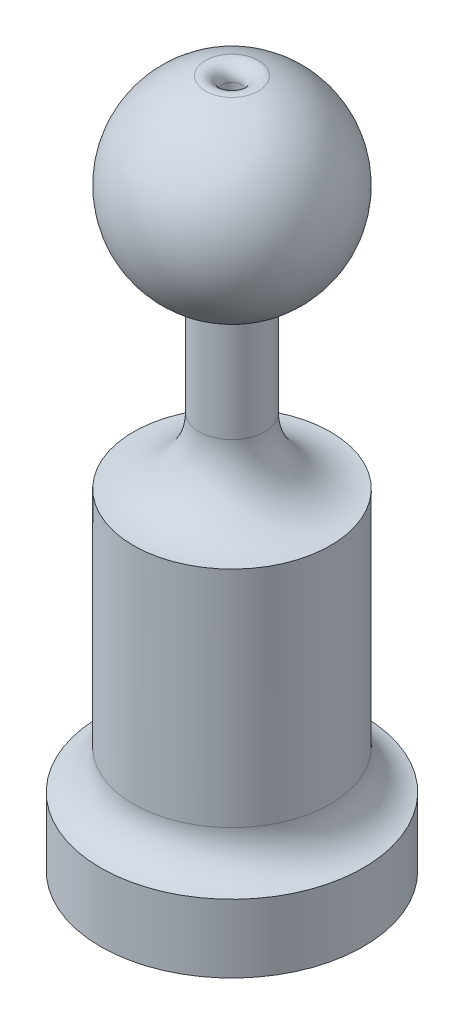
ISO-10303-21;
HEADER;
FILE_DESCRIPTION(('STEP AP214'),'2;1');
FILE_NAME('part.step','',(''),(''),'','','');
FILE_SCHEMA(('AUTOMOTIVE_DESIGN { 1 0 10303 214 1 1 1 1 }'));
ENDSEC;
DATA;
#1=APPLICATION_CONTEXT('core data for automotive mechanical design processes');
#2=APPLICATION_PROTOCOL_DEFINITION('international standard','automotive_design',2000,#1);
#3=PRODUCT_CONTEXT('',#1,'mechanical');
#4=PRODUCT('Part','Part','',(#3));
#5=PRODUCT_RELATED_PRODUCT_CATEGORY('part','',(#4));
#6=PRODUCT_DEFINITION_FORMATION('','',#4);
#7=PRODUCT_DEFINITION_CONTEXT('part definition',#1,'design');
#8=PRODUCT_DEFINITION('design','',#6,#7);
#9=PRODUCT_DEFINITION_SHAPE('','',#8);
#10=(LENGTH_UNIT() NAMED_UNIT(*) SI_UNIT(.MILLI.,.METRE.));
#11=(NAMED_UNIT(*) PLANE_ANGLE_UNIT() SI_UNIT($,.RADIAN.));
#12=(NAMED_UNIT(*) SI_UNIT($,.STERADIAN.) SOLID_ANGLE_UNIT());
#13=UNCERTAINTY_MEASURE_WITH_UNIT(LENGTH_MEASURE(1.E-05),#10,'distance_accuracy_value','');
#14=(GEOMETRIC_REPRESENTATION_CONTEXT(3) GLOBAL_UNCERTAINTY_ASSIGNED_CONTEXT((#13)) GLOBAL_UNIT_ASSIGNED_CONTEXT((#10,
#11,#12)) REPRESENTATION_CONTEXT('',''));
#15=CARTESIAN_POINT('',(0.,0.,0.));
#16=DIRECTION('',(0.,0.,1.));
#17=DIRECTION('',(1.,0.,0.));
#18=AXIS2_PLACEMENT_3D('',#15,#16,#17);
#19=CARTESIAN_POINT('',(-14.2773261963955,47.3146820377483,0.));
#20=DIRECTION('',(0.,-1.,0.));
#21=DIRECTION('',(0.,0.,-1.));
#22=AXIS2_PLACEMENT_3D('',#19,#20,#21);
#23=CYLINDRICAL_SURFACE('',#22,2.5);
#24=CARTESIAN_POINT('',(-14.2773261963955,32.3146820377483,0.));
#25=DIRECTION('',(0.,1.,0.));
#26=DIRECTION('',(0.,0.,1.));
#27=AXIS2_PLACEMENT_3D('',#24,#25,#26);
#28=CIRCLE('',#27,2.5);
#29=CARTESIAN_POINT('',(-14.2773261963955,32.3146820377483,2.5));
#30=VERTEX_POINT('',#29);
#31=EDGE_CURVE('E61',#30,#30,#28,.T.);
#32=ORIENTED_EDGE('',*,*,#31,.T.);
#33=EDGE_LOOP('',(#32));
#34=FACE_BOUND('',#33,.T.);
#35=CARTESIAN_POINT('',(-14.2773261963955,40.2436142258829,0.));
#36=DIRECTION('',(0.,1.,0.));
#37=DIRECTION('',(0.,0.,1.));
#38=AXIS2_PLACEMENT_3D('',#35,#36,#37);
#39=CIRCLE('',#38,2.5);
#40=CARTESIAN_POINT('',(-14.2773261963955,40.2436142258829,2.5));
#41=VERTEX_POINT('',#40);
#42=EDGE_CURVE('E67',#41,#41,#39,.T.);
#43=ORIENTED_EDGE('',*,*,#42,.F.);
#44=EDGE_LOOP('',(#43));
#45=FACE_BOUND('',#44,.T.);
#46=ADVANCED_FACE('F43',(#34,#45),#23,.T.);
#47=CARTESIAN_POINT('',(-14.2773261963955,7.31468203774834,0.));
#48=DIRECTION('',(0.,1.,0.));
#49=DIRECTION('',(0.,0.,1.));
#50=AXIS2_PLACEMENT_3D('',#47,#48,#49);
#51=CYLINDRICAL_SURFACE('',#50,5.06);
#52=CARTESIAN_POINT('',(-14.2773261963955,1.10694016835957,0.));
#53=DIRECTION('',(0.,-1.,0.));
#54=DIRECTION('',(0.,0.,-1.));
#55=AXIS2_PLACEMENT_3D('',#52,#53,#54);
#56=CIRCLE('',#55,5.06);
#57=CARTESIAN_POINT('',(-14.2773261963955,1.10694016835957,-5.06));
#58=VERTEX_POINT('',#57);
#59=EDGE_CURVE('E71',#58,#58,#56,.T.);
#60=ORIENTED_EDGE('',*,*,#59,.T.);
#61=EDGE_LOOP('',(#60));
#62=FACE_BOUND('',#61,.T.);
#63=CARTESIAN_POINT('',(-14.2773261963955,10.4140632567583,0.));
#64=DIRECTION('',(0.,-1.,0.));
#65=DIRECTION('',(0.,0.,-1.));
#66=AXIS2_PLACEMENT_3D('',#63,#64,#65);
#67=CIRCLE('',#66,5.06);
#68=CARTESIAN_POINT('',(-14.2773261963955,10.4140632567583,-5.06));
#69=VERTEX_POINT('',#68);
#70=EDGE_CURVE('E91',#69,#69,#67,.T.);
#71=ORIENTED_EDGE('',*,*,#70,.F.);
#72=EDGE_LOOP('',(#71));
#73=FACE_BOUND('',#72,.T.);
#74=ADVANCED_FACE('F110',(#62,#73),#51,.F.);
#75=CARTESIAN_POINT('',(-14.2773261963955,2.12268079837005,0.));
#76=DIRECTION('',(0.,1.,0.));
#77=DIRECTION('',(0.,0.,1.));
#78=AXIS2_PLACEMENT_3D('',#75,#76,#77);
#79=CONICAL_SURFACE('',#78,10.,1.0701727383901);
#80=CARTESIAN_POINT('',(-14.2773261963955,0.22965674128613,0.));
#81=DIRECTION('',(0.,1.,0.));
#82=DIRECTION('',(0.,0.,1.));
#83=AXIS2_PLACEMENT_3D('',#80,#81,#82);
#84=CIRCLE('',#83,6.53997269566328);
#85=CARTESIAN_POINT('',(-14.2773261963955,0.22965674128613,6.53997269566328));
#86=VERTEX_POINT('',#85);
#87=EDGE_CURVE('E75',#86,#86,#84,.T.);
#88=ORIENTED_EDGE('',*,*,#87,.T.);
#89=EDGE_LOOP('',(#88));
#90=FACE_BOUND('',#89,.T.);
#91=CARTESIAN_POINT('',(-14.2773261963955,2.12268079837005,0.));
#92=DIRECTION('',(0.,1.,0.));
#93=DIRECTION('',(0.,0.,1.));
#94=AXIS2_PLACEMENT_3D('',#91,#92,#93);
#95=CIRCLE('',#94,10.);
#96=CARTESIAN_POINT('',(-14.2773261963955,2.12268079837005,10.));
#97=VERTEX_POINT('',#96);
#98=EDGE_CURVE('E79',#97,#97,#95,.T.);
#99=ORIENTED_EDGE('',*,*,#98,.F.);
#100=EDGE_LOOP('',(#99));
#101=FACE_BOUND('',#100,.T.);
#102=ADVANCED_FACE('F112',(#90,#101),#79,.T.);
#103=CARTESIAN_POINT('',(-14.2773261963955,7.31468203774834,0.));
#104=DIRECTION('',(0.,1.,0.));
#105=DIRECTION('',(0.,0.,1.));
#106=AXIS2_PLACEMENT_3D('',#103,#104,#105);
#107=CYLINDRICAL_SURFACE('',#106,10.);
#108=ORIENTED_EDGE('',*,*,#98,.T.);
#109=EDGE_LOOP('',(#108));
#110=FACE_BOUND('',#109,.T.);
#111=CARTESIAN_POINT('',(-14.2773261963955,7.31468203774834,0.));
#112=DIRECTION('',(0.,1.,0.));
#113=DIRECTION('',(0.,0.,1.));
#114=AXIS2_PLACEMENT_3D('',#111,#112,#113);
#115=CIRCLE('',#114,10.);
#116=CARTESIAN_POINT('',(-14.2773261963955,7.31468203774834,10.));
#117=VERTEX_POINT('',#116);
#118=EDGE_CURVE('E83',#117,#117,#115,.T.);
#119=ORIENTED_EDGE('',*,*,#118,.F.);
#120=EDGE_LOOP('',(#119));
#121=FACE_BOUND('',#120,.T.);
#122=ADVANCED_FACE('F119',(#110,#121),#107,.T.);
#123=CARTESIAN_POINT('',(-14.2773261963955,1.10694016835957,0.));
#124=DIRECTION('',(0.,-1.,0.));
#125=DIRECTION('',(0.,0.,-1.));
#126=AXIS2_PLACEMENT_3D('',#123,#124,#125);
#127=TOROIDAL_SURFACE('',#126,6.06,1.);
#128=ORIENTED_EDGE('',*,*,#59,.F.);
#129=EDGE_LOOP('',(#128));
#130=FACE_BOUND('',#129,.T.);
#131=ORIENTED_EDGE('',*,*,#87,.F.);
#132=EDGE_LOOP('',(#131));
#133=FACE_BOUND('',#132,.T.);
#134=ADVANCED_FACE('F126',(#130,#133),#127,.T.);
#135=CARTESIAN_POINT('',(-14.2773261963955,27.3146820377483,0.));
#136=DIRECTION('',(0.,-1.,0.));
#137=DIRECTION('',(0.,0.,-1.));
#138=AXIS2_PLACEMENT_3D('',#135,#136,#137);
#139=CYLINDRICAL_SURFACE('',#138,7.5);
#140=CARTESIAN_POINT('',(-14.2773261963955,10.2727219292981,0.));
#141=DIRECTION('',(0.,-1.,0.));
#142=DIRECTION('',(0.,0.,-1.));
#143=AXIS2_PLACEMENT_3D('',#140,#141,#142);
#144=CIRCLE('',#143,7.5);
#145=CARTESIAN_POINT('',(-14.2773261963955,10.2727219292981,-7.5));
#146=VERTEX_POINT('',#145);
#147=EDGE_CURVE('E10',#146,#146,#144,.F.);
#148=ORIENTED_EDGE('',*,*,#147,.T.);
#149=EDGE_LOOP('',(#148));
#150=FACE_BOUND('',#149,.T.);
#151=CARTESIAN_POINT('',(-14.2773261963955,27.3146820377483,0.));
#152=DIRECTION('',(0.,1.,0.));
#153=DIRECTION('',(0.,0.,1.));
#154=AXIS2_PLACEMENT_3D('',#151,#152,#153);
#155=CIRCLE('',#154,7.5);
#156=CARTESIAN_POINT('',(-14.2773261963955,27.3146820377483,7.5));
#157=VERTEX_POINT('',#156);
#158=EDGE_CURVE('E87',#157,#157,#155,.T.);
#159=ORIENTED_EDGE('',*,*,#158,.F.);
#160=EDGE_LOOP('',(#159));
#161=FACE_BOUND('',#160,.T.);
#162=ADVANCED_FACE('F106',(#150,#161),#139,.T.);
#163=CARTESIAN_POINT('',(-14.2773261963955,10.4140632567583,0.));
#164=DIRECTION('',(0.,-1.,0.));
#165=DIRECTION('',(0.,0.,-1.));
#166=AXIS2_PLACEMENT_3D('',#163,#164,#165);
#167=PLANE('',#166);
#168=CARTESIAN_POINT('',(-14.2773261963955,10.4140632567583,0.));
#169=DIRECTION('',(0.,-1.,0.));
#170=DIRECTION('',(0.,0.,-1.));
#171=AXIS2_PLACEMENT_3D('',#168,#169,#170);
#172=CIRCLE('',#171,0.75);
#173=CARTESIAN_POINT('',(-14.2773261963955,10.4140632567583,-0.75));
#174=VERTEX_POINT('',#173);
#175=EDGE_CURVE('E95',#174,#174,#172,.T.);
#176=ORIENTED_EDGE('',*,*,#175,.F.);
#177=EDGE_LOOP('',(#176));
#178=FACE_BOUND('',#177,.T.);
#179=ORIENTED_EDGE('',*,*,#70,.T.);
#180=EDGE_LOOP('',(#179));
#181=FACE_BOUND('',#180,.T.);
#182=ADVANCED_FACE('F102',(#178,#181),#167,.T.);
#183=CARTESIAN_POINT('',(-14.2773261963955,47.3146820377483,0.));
#184=DIRECTION('',(-1.,0.,0.));
#185=DIRECTION('',(0.,0.,-1.));
#186=AXIS2_PLACEMENT_3D('',#183,#184,#185);
#187=SPHERICAL_SURFACE('',#186,7.5);
#188=CARTESIAN_POINT('',(-14.2773261963955,47.3146820377483,0.));
#189=DIRECTION('',(0.,-1.,0.));
#190=DIRECTION('',(0.,0.,-1.));
#191=AXIS2_PLACEMENT_3D('',#188,#189,#190);
#192=SPHERICAL_SURFACE('',#191,7.5);
#193=CARTESIAN_POINT('',(-14.2773261963955,54.5377497447958,0.));
#194=DIRECTION('',(0.,-1.,0.));
#195=DIRECTION('',(0.,0.,-1.));
#196=AXIS2_PLACEMENT_3D('',#193,#194,#195);
#197=CIRCLE('',#196,2.01923076923077);
#198=CARTESIAN_POINT('',(-14.2773261963955,54.5377497447958,-2.01923076923077));
#199=VERTEX_POINT('',#198);
#200=EDGE_CURVE('E56',#199,#199,#197,.T.);
#201=ORIENTED_EDGE('',*,*,#200,.T.);
#202=EDGE_LOOP('',(#201));
#203=FACE_BOUND('',#202,.T.);
#204=ORIENTED_EDGE('',*,*,#42,.T.);
#205=EDGE_LOOP('',(#204));
#206=FACE_BOUND('',#205,.T.);
#207=ADVANCED_FACE('F105',(#203,#206),#192,.T.);
#208=CARTESIAN_POINT('',(-14.2773261963955,32.3146820377483,0.));
#209=DIRECTION('',(0.,1.,0.));
#210=DIRECTION('',(0.,0.,1.));
#211=AXIS2_PLACEMENT_3D('',#208,#209,#210);
#212=TOROIDAL_SURFACE('',#211,7.5,5.);
#213=ORIENTED_EDGE('',*,*,#158,.T.);
#214=EDGE_LOOP('',(#213));
#215=FACE_BOUND('',#214,.T.);
#216=ORIENTED_EDGE('',*,*,#31,.F.);
#217=EDGE_LOOP('',(#216));
#218=FACE_BOUND('',#217,.T.);
#219=ADVANCED_FACE('F130',(#215,#218),#212,.F.);
#220=CARTESIAN_POINT('',(-14.2773261963955,55.4140632567583,0.));
#221=DIRECTION('',(0.,-1.,0.));
#222=DIRECTION('',(0.,0.,-1.));
#223=AXIS2_PLACEMENT_3D('',#220,#221,#222);
#224=CYLINDRICAL_SURFACE('',#223,0.75);
#225=CARTESIAN_POINT('',(-14.2773261963955,53.5746740505228,0.));
#226=DIRECTION('',(0.,-1.,0.));
#227=DIRECTION('',(0.,0.,-1.));
#228=AXIS2_PLACEMENT_3D('',#225,#226,#227);
#229=CIRCLE('',#228,0.75);
#230=CARTESIAN_POINT('',(-14.2773261963955,53.5746740505228,-0.75));
#231=VERTEX_POINT('',#230);
#232=EDGE_CURVE('E51',#231,#231,#229,.F.);
#233=ORIENTED_EDGE('',*,*,#232,.T.);
#234=EDGE_LOOP('',(#233));
#235=FACE_BOUND('',#234,.T.);
#236=ORIENTED_EDGE('',*,*,#175,.T.);
#237=EDGE_LOOP('',(#236));
#238=FACE_BOUND('',#237,.T.);
#239=ADVANCED_FACE('F100',(#235,#238),#224,.F.);
#240=CARTESIAN_POINT('',(-14.2773261963955,53.5746740505228,0.));
#241=DIRECTION('',(0.,-1.,0.));
#242=DIRECTION('',(0.,0.,-1.));
#243=AXIS2_PLACEMENT_3D('',#240,#241,#242);
#244=TOROIDAL_SURFACE('',#243,1.75,1.);
#245=ORIENTED_EDGE('',*,*,#232,.F.);
#246=EDGE_LOOP('',(#245));
#247=FACE_BOUND('',#246,.T.);
#248=ORIENTED_EDGE('',*,*,#200,.F.);
#249=EDGE_LOOP('',(#248));
#250=FACE_BOUND('',#249,.T.);
#251=ADVANCED_FACE('F133',(#247,#250),#244,.T.);
#252=CARTESIAN_POINT('',(-14.2773261963955,10.2727219292981,0.));
#253=DIRECTION('',(0.,-1.,0.));
#254=DIRECTION('',(0.,0.,-1.));
#255=AXIS2_PLACEMENT_3D('',#252,#253,#254);
#256=TOROIDAL_SURFACE('',#255,10.5,3.);
#257=ORIENTED_EDGE('',*,*,#118,.T.);
#258=EDGE_LOOP('',(#257));
#259=FACE_BOUND('',#258,.T.);
#260=ORIENTED_EDGE('',*,*,#147,.F.);
#261=EDGE_LOOP('',(#260));
#262=FACE_BOUND('',#261,.T.);
#263=ADVANCED_FACE('F45',(#259,#262),#256,.F.);
#264=CLOSED_SHELL('',(#46,#74,#102,#122,#134,#162,#182,#207,#219,#239,#251,#263));
#265=MANIFOLD_SOLID_BREP('B2',#264);
#266=ADVANCED_BREP_SHAPE_REPRESENTATION('',(#18,#265),#14);
#267=SHAPE_DEFINITION_REPRESENTATION(#9,#266);
ENDSEC;
END-ISO-10303-21;
